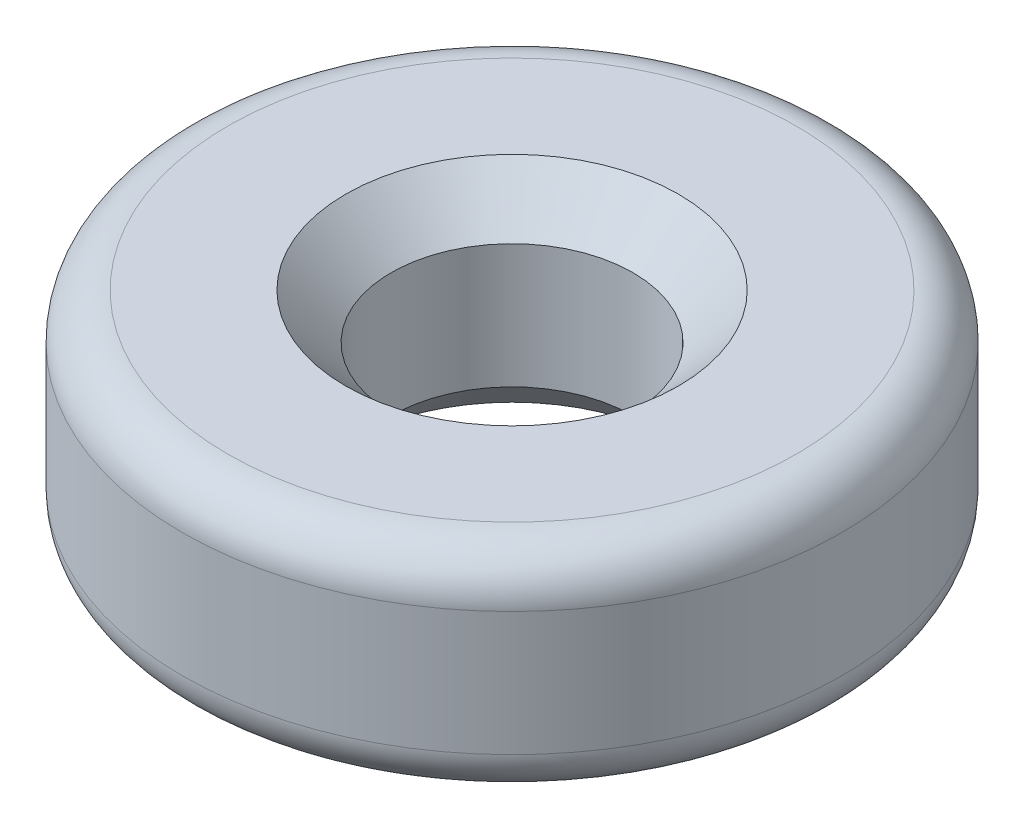
ISO-10303-21;
HEADER;
FILE_DESCRIPTION(('STEP AP214'),'2;1');
FILE_NAME('part.step','',(''),(''),'','','');
FILE_SCHEMA(('AUTOMOTIVE_DESIGN { 1 0 10303 214 1 1 1 1 }'));
ENDSEC;
DATA;
#1=APPLICATION_CONTEXT('core data for automotive mechanical design processes');
#2=APPLICATION_PROTOCOL_DEFINITION('international standard','automotive_design',2000,#1);
#3=PRODUCT_CONTEXT('',#1,'mechanical');
#4=PRODUCT('Part','Part','',(#3));
#5=PRODUCT_RELATED_PRODUCT_CATEGORY('part','',(#4));
#6=PRODUCT_DEFINITION_FORMATION('','',#4);
#7=PRODUCT_DEFINITION_CONTEXT('part definition',#1,'design');
#8=PRODUCT_DEFINITION('design','',#6,#7);
#9=PRODUCT_DEFINITION_SHAPE('','',#8);
#10=(LENGTH_UNIT() NAMED_UNIT(*) SI_UNIT(.MILLI.,.METRE.));
#11=(NAMED_UNIT(*) PLANE_ANGLE_UNIT() SI_UNIT($,.RADIAN.));
#12=(NAMED_UNIT(*) SI_UNIT($,.STERADIAN.) SOLID_ANGLE_UNIT());
#13=UNCERTAINTY_MEASURE_WITH_UNIT(LENGTH_MEASURE(1.E-05),#10,'distance_accuracy_value','');
#14=(GEOMETRIC_REPRESENTATION_CONTEXT(3) GLOBAL_UNCERTAINTY_ASSIGNED_CONTEXT((#13)) GLOBAL_UNIT_ASSIGNED_CONTEXT((#10,
#11,#12)) REPRESENTATION_CONTEXT('',''));
#15=CARTESIAN_POINT('',(0.,0.,0.));
#16=DIRECTION('',(0.,0.,1.));
#17=DIRECTION('',(1.,0.,0.));
#18=AXIS2_PLACEMENT_3D('',#15,#16,#17);
#19=CARTESIAN_POINT('',(0.,1.8034,0.));
#20=DIRECTION('',(0.,1.,0.));
#21=DIRECTION('',(0.,0.,1.));
#22=AXIS2_PLACEMENT_3D('',#19,#20,#21);
#23=PLANE('',#22);
#24=CARTESIAN_POINT('',(0.,1.8034,0.));
#25=DIRECTION('',(0.,1.,0.));
#26=DIRECTION('',(0.,0.,1.));
#27=AXIS2_PLACEMENT_3D('',#24,#25,#26);
#28=CIRCLE('',#27,1.397);
#29=CARTESIAN_POINT('',(0.,1.8034,1.397));
#30=VERTEX_POINT('',#29);
#31=EDGE_CURVE('E10',#30,#30,#28,.F.);
#32=ORIENTED_EDGE('',*,*,#31,.T.);
#33=EDGE_LOOP('',(#32));
#34=FACE_BOUND('',#33,.T.);
#35=CARTESIAN_POINT('',(0.,1.8034,0.));
#36=DIRECTION('',(0.,1.,0.));
#37=DIRECTION('',(0.,0.,1.));
#38=AXIS2_PLACEMENT_3D('',#35,#36,#37);
#39=CIRCLE('',#38,2.3876);
#40=CARTESIAN_POINT('',(0.,1.8034,2.3876));
#41=VERTEX_POINT('',#40);
#42=EDGE_CURVE('E50',#41,#41,#39,.T.);
#43=ORIENTED_EDGE('',*,*,#42,.T.);
#44=EDGE_LOOP('',(#43));
#45=FACE_BOUND('',#44,.T.);
#46=ADVANCED_FACE('F30',(#34,#45),#23,.T.);
#47=CARTESIAN_POINT('',(0.,0.,0.));
#48=DIRECTION('',(0.,1.,0.));
#49=DIRECTION('',(0.,0.,1.));
#50=AXIS2_PLACEMENT_3D('',#47,#48,#49);
#51=PLANE('',#50);
#52=CARTESIAN_POINT('',(0.,0.,0.));
#53=DIRECTION('',(0.,1.,0.));
#54=DIRECTION('',(0.,0.,1.));
#55=AXIS2_PLACEMENT_3D('',#52,#53,#54);
#56=CIRCLE('',#55,1.397);
#57=CARTESIAN_POINT('',(0.,0.,-1.397));
#58=VERTEX_POINT('',#57);
#59=EDGE_CURVE('E45',#58,#58,#56,.T.);
#60=ORIENTED_EDGE('',*,*,#59,.T.);
#61=EDGE_LOOP('',(#60));
#62=FACE_BOUND('',#61,.T.);
#63=CARTESIAN_POINT('',(0.,0.,0.));
#64=DIRECTION('',(0.,1.,0.));
#65=DIRECTION('',(0.,0.,1.));
#66=AXIS2_PLACEMENT_3D('',#63,#64,#65);
#67=CIRCLE('',#66,2.3876);
#68=CARTESIAN_POINT('',(0.,0.,2.3876));
#69=VERTEX_POINT('',#68);
#70=EDGE_CURVE('E53',#69,#69,#67,.F.);
#71=ORIENTED_EDGE('',*,*,#70,.T.);
#72=EDGE_LOOP('',(#71));
#73=FACE_BOUND('',#72,.T.);
#74=ADVANCED_FACE('F74',(#62,#73),#51,.F.);
#75=CARTESIAN_POINT('',(0.,1.8034,0.));
#76=DIRECTION('',(0.,-1.,0.));
#77=DIRECTION('',(0.,0.,-1.));
#78=AXIS2_PLACEMENT_3D('',#75,#76,#77);
#79=CYLINDRICAL_SURFACE('',#78,2.7686);
#80=CARTESIAN_POINT('',(0.,0.381,0.));
#81=DIRECTION('',(0.,1.,0.));
#82=DIRECTION('',(0.,0.,1.));
#83=AXIS2_PLACEMENT_3D('',#80,#81,#82);
#84=CIRCLE('',#83,2.7686);
#85=CARTESIAN_POINT('',(0.,0.381,2.7686));
#86=VERTEX_POINT('',#85);
#87=EDGE_CURVE('E56',#86,#86,#84,.T.);
#88=ORIENTED_EDGE('',*,*,#87,.T.);
#89=EDGE_LOOP('',(#88));
#90=FACE_BOUND('',#89,.T.);
#91=CARTESIAN_POINT('',(0.,1.4224,0.));
#92=DIRECTION('',(0.,1.,0.));
#93=DIRECTION('',(0.,0.,1.));
#94=AXIS2_PLACEMENT_3D('',#91,#92,#93);
#95=CIRCLE('',#94,2.7686);
#96=CARTESIAN_POINT('',(0.,1.4224,2.7686));
#97=VERTEX_POINT('',#96);
#98=EDGE_CURVE('E59',#97,#97,#95,.F.);
#99=ORIENTED_EDGE('',*,*,#98,.T.);
#100=EDGE_LOOP('',(#99));
#101=FACE_BOUND('',#100,.T.);
#102=ADVANCED_FACE('F63',(#90,#101),#79,.T.);
#103=CARTESIAN_POINT('',(0.,1.8034,0.));
#104=DIRECTION('',(0.,-1.,0.));
#105=DIRECTION('',(0.,0.,-1.));
#106=AXIS2_PLACEMENT_3D('',#103,#104,#105);
#107=CYLINDRICAL_SURFACE('',#106,1.016);
#108=CARTESIAN_POINT('',(0.,0.381000000000002,0.));
#109=DIRECTION('',(0.,1.,0.));
#110=DIRECTION('',(0.,0.,1.));
#111=AXIS2_PLACEMENT_3D('',#108,#109,#110);
#112=CIRCLE('',#111,1.016);
#113=CARTESIAN_POINT('',(0.,0.381000000000002,-1.016));
#114=VERTEX_POINT('',#113);
#115=EDGE_CURVE('E37',#114,#114,#112,.F.);
#116=ORIENTED_EDGE('',*,*,#115,.T.);
#117=EDGE_LOOP('',(#116));
#118=FACE_BOUND('',#117,.T.);
#119=CARTESIAN_POINT('',(0.,1.4224,0.));
#120=DIRECTION('',(0.,1.,0.));
#121=DIRECTION('',(0.,0.,1.));
#122=AXIS2_PLACEMENT_3D('',#119,#120,#121);
#123=CIRCLE('',#122,1.016);
#124=CARTESIAN_POINT('',(0.,1.4224,1.016));
#125=VERTEX_POINT('',#124);
#126=EDGE_CURVE('E41',#125,#125,#123,.T.);
#127=ORIENTED_EDGE('',*,*,#126,.T.);
#128=EDGE_LOOP('',(#127));
#129=FACE_BOUND('',#128,.T.);
#130=ADVANCED_FACE('F82',(#118,#129),#107,.F.);
#131=CARTESIAN_POINT('',(0.,0.381,0.));
#132=DIRECTION('',(0.,1.,0.));
#133=DIRECTION('',(0.,0.,1.));
#134=AXIS2_PLACEMENT_3D('',#131,#132,#133);
#135=TOROIDAL_SURFACE('',#134,2.3876,0.381);
#136=ORIENTED_EDGE('',*,*,#70,.F.);
#137=EDGE_LOOP('',(#136));
#138=FACE_BOUND('',#137,.T.);
#139=ORIENTED_EDGE('',*,*,#87,.F.);
#140=EDGE_LOOP('',(#139));
#141=FACE_BOUND('',#140,.T.);
#142=ADVANCED_FACE('F69',(#138,#141),#135,.T.);
#143=CARTESIAN_POINT('',(0.,1.4224,0.));
#144=DIRECTION('',(0.,1.,0.));
#145=DIRECTION('',(0.,0.,1.));
#146=AXIS2_PLACEMENT_3D('',#143,#144,#145);
#147=TOROIDAL_SURFACE('',#146,2.3876,0.381);
#148=ORIENTED_EDGE('',*,*,#98,.F.);
#149=EDGE_LOOP('',(#148));
#150=FACE_BOUND('',#149,.T.);
#151=ORIENTED_EDGE('',*,*,#42,.F.);
#152=EDGE_LOOP('',(#151));
#153=FACE_BOUND('',#152,.T.);
#154=ADVANCED_FACE('F65',(#150,#153),#147,.T.);
#155=CARTESIAN_POINT('',(0.,0.,0.));
#156=DIRECTION('',(0.,-1.,0.));
#157=DIRECTION('',(0.,0.,-1.));
#158=AXIS2_PLACEMENT_3D('',#155,#156,#157);
#159=CONICAL_SURFACE('',#158,1.397,0.785398163397447);
#160=CARTESIAN_POINT('',(0.,0.381000000000002,-1.016));
#161=CARTESIAN_POINT('',(0.,0.377031250000002,-1.01996875));
#162=CARTESIAN_POINT('',(0.,0.373062500000002,-1.0239375));
#163=CARTESIAN_POINT('',(0.,0.365125000000002,-1.031875));
#164=CARTESIAN_POINT('',(0.,0.361156250000002,-1.03584375));
#165=CARTESIAN_POINT('',(0.,0.353218750000002,-1.04378125));
#166=CARTESIAN_POINT('',(0.,0.349250000000002,-1.04775));
#167=CARTESIAN_POINT('',(0.,0.341312500000002,-1.0556875));
#168=CARTESIAN_POINT('',(0.,0.337343750000001,-1.05965625));
#169=CARTESIAN_POINT('',(0.,0.329406250000001,-1.06759375));
#170=CARTESIAN_POINT('',(0.,0.325437500000001,-1.0715625));
#171=CARTESIAN_POINT('',(0.,0.317500000000001,-1.0795));
#172=CARTESIAN_POINT('',(0.,0.313531250000001,-1.08346875));
#173=CARTESIAN_POINT('',(0.,0.305593750000001,-1.09140625));
#174=CARTESIAN_POINT('',(0.,0.301625000000001,-1.095375));
#175=CARTESIAN_POINT('',(0.,0.293687500000001,-1.1033125));
#176=CARTESIAN_POINT('',(0.,0.289718750000001,-1.10728125));
#177=CARTESIAN_POINT('',(0.,0.281781250000001,-1.11521875));
#178=CARTESIAN_POINT('',(0.,0.277812500000001,-1.1191875));
#179=CARTESIAN_POINT('',(0.,0.269875000000001,-1.127125));
#180=CARTESIAN_POINT('',(0.,0.265906250000001,-1.13109375));
#181=CARTESIAN_POINT('',(0.,0.257968750000001,-1.13903125));
#182=CARTESIAN_POINT('',(0.,0.254000000000001,-1.143));
#183=CARTESIAN_POINT('',(0.,0.246062500000001,-1.1509375));
#184=CARTESIAN_POINT('',(0.,0.242093750000001,-1.15490625));
#185=CARTESIAN_POINT('',(0.,0.234156250000001,-1.16284375));
#186=CARTESIAN_POINT('',(0.,0.230187500000001,-1.1668125));
#187=CARTESIAN_POINT('',(0.,0.222250000000001,-1.17475));
#188=CARTESIAN_POINT('',(0.,0.218281250000001,-1.17871875));
#189=CARTESIAN_POINT('',(0.,0.210343750000001,-1.18665625));
#190=CARTESIAN_POINT('',(0.,0.206375000000001,-1.190625));
#191=CARTESIAN_POINT('',(0.,0.198437500000001,-1.1985625));
#192=CARTESIAN_POINT('',(0.,0.194468750000001,-1.20253125));
#193=CARTESIAN_POINT('',(0.,0.186531250000001,-1.21046875));
#194=CARTESIAN_POINT('',(0.,0.182562500000001,-1.2144375));
#195=CARTESIAN_POINT('',(0.,0.174625000000001,-1.222375));
#196=CARTESIAN_POINT('',(0.,0.170656250000001,-1.22634375));
#197=CARTESIAN_POINT('',(0.,0.162718750000001,-1.23428125));
#198=CARTESIAN_POINT('',(0.,0.158750000000001,-1.23825));
#199=CARTESIAN_POINT('',(0.,0.150812500000001,-1.2461875));
#200=CARTESIAN_POINT('',(0.,0.146843750000001,-1.25015625));
#201=CARTESIAN_POINT('',(0.,0.138906250000001,-1.25809375));
#202=CARTESIAN_POINT('',(0.,0.134937500000001,-1.2620625));
#203=CARTESIAN_POINT('',(0.,0.127000000000001,-1.27));
#204=CARTESIAN_POINT('',(0.,0.123031250000001,-1.27396875));
#205=CARTESIAN_POINT('',(0.,0.115093750000001,-1.28190625));
#206=CARTESIAN_POINT('',(0.,0.111125000000001,-1.285875));
#207=CARTESIAN_POINT('',(0.,0.1031875,-1.2938125));
#208=CARTESIAN_POINT('',(0.,0.0992187500000004,-1.29778125));
#209=CARTESIAN_POINT('',(0.,0.0912812500000004,-1.30571875));
#210=CARTESIAN_POINT('',(0.,0.0873125000000004,-1.3096875));
#211=CARTESIAN_POINT('',(0.,0.0793750000000004,-1.317625));
#212=CARTESIAN_POINT('',(0.,0.0754062500000003,-1.32159375));
#213=CARTESIAN_POINT('',(0.,0.0674687500000003,-1.32953125));
#214=CARTESIAN_POINT('',(0.,0.0635000000000003,-1.3335));
#215=CARTESIAN_POINT('',(0.,0.0555625000000003,-1.3414375));
#216=CARTESIAN_POINT('',(0.,0.0515937500000003,-1.34540625));
#217=CARTESIAN_POINT('',(0.,0.0436562500000002,-1.35334375));
#218=CARTESIAN_POINT('',(0.,0.0396875000000002,-1.3573125));
#219=CARTESIAN_POINT('',(0.,0.0317500000000001,-1.36525));
#220=CARTESIAN_POINT('',(0.,0.0277812500000001,-1.36921875));
#221=CARTESIAN_POINT('',(0.,0.0198437500000001,-1.37715625));
#222=CARTESIAN_POINT('',(0.,0.0158750000000001,-1.381125));
#223=CARTESIAN_POINT('',(0.,0.0079375,-1.3890625));
#224=CARTESIAN_POINT('',(0.,0.00396874999999997,-1.39303125));
#225=CARTESIAN_POINT('',(0.,0.,-1.397));
#226=B_SPLINE_CURVE_WITH_KNOTS('',3,(#160,#161,#162,#163,#164,#165,#166,#167,#168,#169,#170,
#171,#172,#173,#174,#175,#176,#177,#178,#179,#180,#181,#182,#183,#184,#185,#186,#187,#188,#189,
#190,#191,#192,#193,#194,#195,#196,#197,#198,#199,#200,#201,#202,#203,#204,#205,#206,#207,#208,
#209,#210,#211,#212,#213,#214,#215,#216,#217,#218,#219,#220,#221,#222,#223,#224,#225),
.UNSPECIFIED.,.F.,.F.,(4,2,2,2,2,2,2,2,2,2,2,2,2,2,2,2,2,2,2,2,2,2,2,2,2,2,2,2,2,2,2,2,4),(0.,
0.0168379802270047,0.0336759604540094,0.0505139406810142,0.0673519209080189,0.0841899011350236,
0.101027881362028,0.117865861589033,0.134703841816038,0.151541822043042,0.168379802270047,
0.185217782497052,0.202055762724057,0.218893742951061,0.235731723178066,0.252569703405071,
0.269407683632075,0.28624566385908,0.303083644086085,0.319921624313089,0.336759604540094,
0.353597584767099,0.370435564994104,0.387273545221108,0.404111525448113,0.420949505675118,
0.437787485902123,0.454625466129127,0.471463446356132,0.488301426583137,0.505139406810141,
0.521977387037146,0.538815367264151),.UNSPECIFIED.);
#227=EDGE_CURVE('BSEAM68',#114,#58,#226,.T.);
#228=ORIENTED_EDGE('',*,*,#115,.F.);
#229=ORIENTED_EDGE('',*,*,#59,.F.);
#230=ORIENTED_EDGE('',*,*,#227,.T.);
#231=ORIENTED_EDGE('',*,*,#227,.F.);
#232=EDGE_LOOP('',(#228,#230,#229,#231));
#233=FACE_BOUND('',#232,.T.);
#234=ADVANCED_FACE('F68',(#233),#159,.F.);
#235=CARTESIAN_POINT('',(0.,1.4224,0.));
#236=DIRECTION('',(0.,1.,0.));
#237=DIRECTION('',(0.,0.,1.));
#238=AXIS2_PLACEMENT_3D('',#235,#236,#237);
#239=CONICAL_SURFACE('',#238,1.016,0.785398163397451);
#240=ORIENTED_EDGE('',*,*,#31,.F.);
#241=EDGE_LOOP('',(#240));
#242=FACE_BOUND('',#241,.T.);
#243=ORIENTED_EDGE('',*,*,#126,.F.);
#244=EDGE_LOOP('',(#243));
#245=FACE_BOUND('',#244,.T.);
#246=ADVANCED_FACE('F32',(#242,#245),#239,.F.);
#247=CLOSED_SHELL('',(#46,#74,#102,#130,#142,#154,#234,#246));
#248=MANIFOLD_SOLID_BREP('B2',#247);
#249=ADVANCED_BREP_SHAPE_REPRESENTATION('',(#18,#248),#14);
#250=SHAPE_DEFINITION_REPRESENTATION(#9,#249);
ENDSEC;
END-ISO-10303-21;
